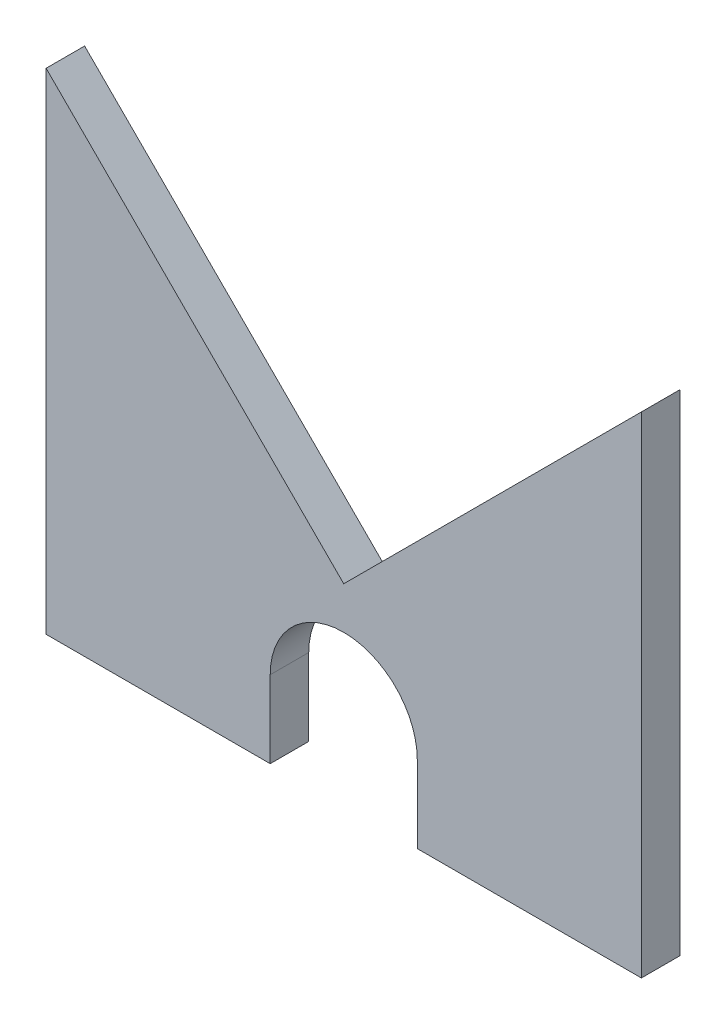
ISO-10303-21;
HEADER;
FILE_DESCRIPTION(('STEP AP214'),'2;1');
FILE_NAME('part.step','',(''),(''),'','','');
FILE_SCHEMA(('AUTOMOTIVE_DESIGN { 1 0 10303 214 1 1 1 1 }'));
ENDSEC;
DATA;
#1=APPLICATION_CONTEXT('core data for automotive mechanical design processes');
#2=APPLICATION_PROTOCOL_DEFINITION('international standard','automotive_design',2000,#1);
#3=PRODUCT_CONTEXT('',#1,'mechanical');
#4=PRODUCT('Part','Part','',(#3));
#5=PRODUCT_RELATED_PRODUCT_CATEGORY('part','',(#4));
#6=PRODUCT_DEFINITION_FORMATION('','',#4);
#7=PRODUCT_DEFINITION_CONTEXT('part definition',#1,'design');
#8=PRODUCT_DEFINITION('design','',#6,#7);
#9=PRODUCT_DEFINITION_SHAPE('','',#8);
#10=(LENGTH_UNIT() NAMED_UNIT(*) SI_UNIT(.MILLI.,.METRE.));
#11=(NAMED_UNIT(*) PLANE_ANGLE_UNIT() SI_UNIT($,.RADIAN.));
#12=(NAMED_UNIT(*) SI_UNIT($,.STERADIAN.) SOLID_ANGLE_UNIT());
#13=UNCERTAINTY_MEASURE_WITH_UNIT(LENGTH_MEASURE(1.E-05),#10,'distance_accuracy_value','');
#14=(GEOMETRIC_REPRESENTATION_CONTEXT(3) GLOBAL_UNCERTAINTY_ASSIGNED_CONTEXT((#13)) GLOBAL_UNIT_ASSIGNED_CONTEXT((#10,
#11,#12)) REPRESENTATION_CONTEXT('',''));
#15=CARTESIAN_POINT('',(0.,0.,0.));
#16=DIRECTION('',(0.,0.,1.));
#17=DIRECTION('',(1.,0.,0.));
#18=AXIS2_PLACEMENT_3D('',#15,#16,#17);
#19=CARTESIAN_POINT('',(17.,4.4,2.2));
#20=DIRECTION('',(0.,0.,-1.));
#21=DIRECTION('',(-1.,0.,0.));
#22=AXIS2_PLACEMENT_3D('',#19,#20,#21);
#23=CYLINDRICAL_SURFACE('',#22,4.2);
#24=CARTESIAN_POINT('',(17.,4.4,0.));
#25=DIRECTION('',(0.,0.,1.));
#26=DIRECTION('',(1.,0.,0.));
#27=AXIS2_PLACEMENT_3D('',#24,#25,#26);
#28=CIRCLE('',#27,4.2);
#29=CARTESIAN_POINT('',(21.2,4.4,0.));
#30=VERTEX_POINT('',#29);
#31=CARTESIAN_POINT('',(12.8,4.4,0.));
#32=VERTEX_POINT('',#31);
#33=EDGE_CURVE('E150',#30,#32,#28,.T.);
#34=ORIENTED_EDGE('',*,*,#33,.F.);
#35=DIRECTION('',(0.,0.,-1.));
#36=VECTOR('',#35,1.);
#37=CARTESIAN_POINT('',(21.2,4.4,2.2));
#38=LINE('',#37,#36);
#39=CARTESIAN_POINT('',(21.2,4.4,2.2));
#40=VERTEX_POINT('',#39);
#41=EDGE_CURVE('E11',#40,#30,#38,.T.);
#42=ORIENTED_EDGE('',*,*,#41,.F.);
#43=CARTESIAN_POINT('',(17.,4.4,2.2));
#44=DIRECTION('',(0.,0.,1.));
#45=DIRECTION('',(1.,0.,0.));
#46=AXIS2_PLACEMENT_3D('',#43,#44,#45);
#47=CIRCLE('',#46,4.2);
#48=CARTESIAN_POINT('',(12.8,4.4,2.2));
#49=VERTEX_POINT('',#48);
#50=EDGE_CURVE('E178',#40,#49,#47,.T.);
#51=ORIENTED_EDGE('',*,*,#50,.T.);
#52=DIRECTION('',(0.,0.,-1.));
#53=VECTOR('',#52,1.);
#54=CARTESIAN_POINT('',(12.8,4.4,2.2));
#55=LINE('',#54,#53);
#56=EDGE_CURVE('E58',#49,#32,#55,.T.);
#57=ORIENTED_EDGE('',*,*,#56,.T.);
#58=EDGE_LOOP('',(#34,#42,#51,#57));
#59=FACE_BOUND('',#58,.T.);
#60=ADVANCED_FACE('F41',(#59),#23,.F.);
#61=CARTESIAN_POINT('',(21.2,0.,2.2));
#62=DIRECTION('',(1.,0.,0.));
#63=DIRECTION('',(0.,0.,-1.));
#64=AXIS2_PLACEMENT_3D('',#61,#62,#63);
#65=PLANE('',#64);
#66=DIRECTION('',(0.,-1.,0.));
#67=VECTOR('',#66,1.);
#68=CARTESIAN_POINT('',(21.2,0.,0.));
#69=LINE('',#68,#67);
#70=CARTESIAN_POINT('',(21.2,0.,0.));
#71=VERTEX_POINT('',#70);
#72=EDGE_CURVE('E153',#30,#71,#69,.T.);
#73=ORIENTED_EDGE('',*,*,#72,.T.);
#74=DIRECTION('',(0.,0.,-1.));
#75=VECTOR('',#74,1.);
#76=CARTESIAN_POINT('',(21.2,0.,2.2));
#77=LINE('',#76,#75);
#78=CARTESIAN_POINT('',(21.2,0.,2.2));
#79=VERTEX_POINT('',#78);
#80=EDGE_CURVE('E50',#79,#71,#77,.T.);
#81=ORIENTED_EDGE('',*,*,#80,.F.);
#82=DIRECTION('',(0.,-1.,0.));
#83=VECTOR('',#82,1.);
#84=CARTESIAN_POINT('',(21.2,0.,2.2));
#85=LINE('',#84,#83);
#86=EDGE_CURVE('E218',#40,#79,#85,.T.);
#87=ORIENTED_EDGE('',*,*,#86,.F.);
#88=ORIENTED_EDGE('',*,*,#41,.T.);
#89=EDGE_LOOP('',(#73,#81,#87,#88));
#90=FACE_BOUND('',#89,.T.);
#91=ADVANCED_FACE('F234',(#90),#65,.F.);
#92=CARTESIAN_POINT('',(0.,0.,2.2));
#93=DIRECTION('',(0.,1.,0.));
#94=DIRECTION('',(0.,0.,1.));
#95=AXIS2_PLACEMENT_3D('',#92,#93,#94);
#96=PLANE('',#95);
#97=DIRECTION('',(1.,0.,0.));
#98=VECTOR('',#97,1.);
#99=CARTESIAN_POINT('',(0.,0.,0.));
#100=LINE('',#99,#98);
#101=CARTESIAN_POINT('',(34.,0.,0.));
#102=VERTEX_POINT('',#101);
#103=EDGE_CURVE('E156',#71,#102,#100,.T.);
#104=ORIENTED_EDGE('',*,*,#103,.T.);
#105=DIRECTION('',(0.,0.,-1.));
#106=VECTOR('',#105,1.);
#107=CARTESIAN_POINT('',(34.,0.,2.2));
#108=LINE('',#107,#106);
#109=CARTESIAN_POINT('',(34.,0.,2.2));
#110=VERTEX_POINT('',#109);
#111=EDGE_CURVE('E191',#110,#102,#108,.T.);
#112=ORIENTED_EDGE('',*,*,#111,.F.);
#113=DIRECTION('',(1.,0.,0.));
#114=VECTOR('',#113,1.);
#115=CARTESIAN_POINT('',(0.,0.,2.2));
#116=LINE('',#115,#114);
#117=EDGE_CURVE('E134',#79,#110,#116,.T.);
#118=ORIENTED_EDGE('',*,*,#117,.F.);
#119=ORIENTED_EDGE('',*,*,#80,.T.);
#120=EDGE_LOOP('',(#104,#112,#118,#119));
#121=FACE_BOUND('',#120,.T.);
#122=ADVANCED_FACE('F200',(#121),#96,.F.);
#123=CARTESIAN_POINT('',(34.,0.,2.2));
#124=DIRECTION('',(-1.,0.,0.));
#125=DIRECTION('',(0.,0.,1.));
#126=AXIS2_PLACEMENT_3D('',#123,#124,#125);
#127=PLANE('',#126);
#128=DIRECTION('',(0.,1.,0.));
#129=VECTOR('',#128,1.);
#130=CARTESIAN_POINT('',(34.,0.,0.));
#131=LINE('',#130,#129);
#132=CARTESIAN_POINT('',(34.,28.,0.));
#133=VERTEX_POINT('',#132);
#134=EDGE_CURVE('E159',#102,#133,#131,.T.);
#135=ORIENTED_EDGE('',*,*,#134,.T.);
#136=DIRECTION('',(0.,0.,-1.));
#137=VECTOR('',#136,1.);
#138=CARTESIAN_POINT('',(34.,28.,2.2));
#139=LINE('',#138,#137);
#140=CARTESIAN_POINT('',(34.,28.,2.2));
#141=VERTEX_POINT('',#140);
#142=EDGE_CURVE('E188',#141,#133,#139,.T.);
#143=ORIENTED_EDGE('',*,*,#142,.F.);
#144=DIRECTION('',(0.,1.,0.));
#145=VECTOR('',#144,1.);
#146=CARTESIAN_POINT('',(34.,0.,2.2));
#147=LINE('',#146,#145);
#148=EDGE_CURVE('E213',#110,#141,#147,.T.);
#149=ORIENTED_EDGE('',*,*,#148,.F.);
#150=ORIENTED_EDGE('',*,*,#111,.T.);
#151=EDGE_LOOP('',(#135,#143,#149,#150));
#152=FACE_BOUND('',#151,.T.);
#153=ADVANCED_FACE('F210',(#152),#127,.F.);
#154=CARTESIAN_POINT('',(3.00000000000007,-3.00000000000006,2.2));
#155=DIRECTION('',(-0.707106781186549,0.707106781186546,0.));
#156=DIRECTION('',(-0.707106781186546,-0.707106781186549,0.));
#157=AXIS2_PLACEMENT_3D('',#154,#155,#156);
#158=PLANE('',#157);
#159=DIRECTION('',(0.707106781186546,0.707106781186549,0.));
#160=VECTOR('',#159,1.);
#161=CARTESIAN_POINT('',(3.00000000000007,-3.00000000000006,0.));
#162=LINE('',#161,#160);
#163=CARTESIAN_POINT('',(17.,10.9999999999999,0.));
#164=VERTEX_POINT('',#163);
#165=EDGE_CURVE('E164',#164,#133,#162,.T.);
#166=ORIENTED_EDGE('',*,*,#165,.F.);
#167=DIRECTION('',(0.,0.,-1.));
#168=VECTOR('',#167,1.);
#169=CARTESIAN_POINT('',(17.,10.9999999999999,2.2));
#170=LINE('',#169,#168);
#171=CARTESIAN_POINT('',(17.,10.9999999999999,2.2));
#172=VERTEX_POINT('',#171);
#173=EDGE_CURVE('E185',#172,#164,#170,.T.);
#174=ORIENTED_EDGE('',*,*,#173,.F.);
#175=DIRECTION('',(0.707106781186546,0.707106781186549,0.));
#176=VECTOR('',#175,1.);
#177=CARTESIAN_POINT('',(3.00000000000007,-3.00000000000006,2.2));
#178=LINE('',#177,#176);
#179=EDGE_CURVE('E144',#172,#141,#178,.T.);
#180=ORIENTED_EDGE('',*,*,#179,.T.);
#181=ORIENTED_EDGE('',*,*,#142,.T.);
#182=EDGE_LOOP('',(#166,#174,#180,#181));
#183=FACE_BOUND('',#182,.T.);
#184=ADVANCED_FACE('F244',(#183),#158,.T.);
#185=CARTESIAN_POINT('',(14.,14.,2.2));
#186=DIRECTION('',(0.707106781186549,0.707106781186546,0.));
#187=DIRECTION('',(-0.707106781186546,0.707106781186549,0.));
#188=AXIS2_PLACEMENT_3D('',#185,#186,#187);
#189=PLANE('',#188);
#190=DIRECTION('',(0.707106781186546,-0.707106781186549,0.));
#191=VECTOR('',#190,1.);
#192=CARTESIAN_POINT('',(14.,14.,0.));
#193=LINE('',#192,#191);
#194=CARTESIAN_POINT('',(0.,28.,0.));
#195=VERTEX_POINT('',#194);
#196=EDGE_CURVE('E168',#195,#164,#193,.T.);
#197=ORIENTED_EDGE('',*,*,#196,.F.);
#198=DIRECTION('',(0.,0.,-1.));
#199=VECTOR('',#198,1.);
#200=CARTESIAN_POINT('',(0.,28.,2.2));
#201=LINE('',#200,#199);
#202=CARTESIAN_POINT('',(0.,28.,2.2));
#203=VERTEX_POINT('',#202);
#204=EDGE_CURVE('E125',#203,#195,#201,.T.);
#205=ORIENTED_EDGE('',*,*,#204,.F.);
#206=DIRECTION('',(0.707106781186546,-0.707106781186549,0.));
#207=VECTOR('',#206,1.);
#208=CARTESIAN_POINT('',(14.,14.,2.2));
#209=LINE('',#208,#207);
#210=EDGE_CURVE('E140',#203,#172,#209,.T.);
#211=ORIENTED_EDGE('',*,*,#210,.T.);
#212=ORIENTED_EDGE('',*,*,#173,.T.);
#213=EDGE_LOOP('',(#197,#205,#211,#212));
#214=FACE_BOUND('',#213,.T.);
#215=ADVANCED_FACE('F247',(#214),#189,.T.);
#216=CARTESIAN_POINT('',(0.,0.,2.2));
#217=DIRECTION('',(-1.,0.,0.));
#218=DIRECTION('',(0.,0.,1.));
#219=AXIS2_PLACEMENT_3D('',#216,#217,#218);
#220=PLANE('',#219);
#221=DIRECTION('',(0.,1.,0.));
#222=VECTOR('',#221,1.);
#223=CARTESIAN_POINT('',(0.,0.,0.));
#224=LINE('',#223,#222);
#225=CARTESIAN_POINT('',(0.,0.,0.));
#226=VERTEX_POINT('',#225);
#227=EDGE_CURVE('E121',#226,#195,#224,.T.);
#228=ORIENTED_EDGE('',*,*,#227,.F.);
#229=DIRECTION('',(0.,0.,-1.));
#230=VECTOR('',#229,1.);
#231=CARTESIAN_POINT('',(0.,0.,2.2));
#232=LINE('',#231,#230);
#233=CARTESIAN_POINT('',(0.,0.,2.2));
#234=VERTEX_POINT('',#233);
#235=EDGE_CURVE('E115',#234,#226,#232,.T.);
#236=ORIENTED_EDGE('',*,*,#235,.F.);
#237=DIRECTION('',(0.,1.,0.));
#238=VECTOR('',#237,1.);
#239=CARTESIAN_POINT('',(0.,0.,2.2));
#240=LINE('',#239,#238);
#241=EDGE_CURVE('E119',#234,#203,#240,.T.);
#242=ORIENTED_EDGE('',*,*,#241,.T.);
#243=ORIENTED_EDGE('',*,*,#204,.T.);
#244=EDGE_LOOP('',(#228,#236,#242,#243));
#245=FACE_BOUND('',#244,.T.);
#246=ADVANCED_FACE('F117',(#245),#220,.T.);
#247=CARTESIAN_POINT('',(12.8,0.,0.));
#248=VERTEX_POINT('',#247);
#249=EDGE_CURVE('E160',#226,#248,#100,.T.);
#250=ORIENTED_EDGE('',*,*,#249,.T.);
#251=DIRECTION('',(0.,0.,-1.));
#252=VECTOR('',#251,1.);
#253=CARTESIAN_POINT('',(12.8,0.,2.2));
#254=LINE('',#253,#252);
#255=CARTESIAN_POINT('',(12.8,0.,2.2));
#256=VERTEX_POINT('',#255);
#257=EDGE_CURVE('E87',#256,#248,#254,.T.);
#258=ORIENTED_EDGE('',*,*,#257,.F.);
#259=EDGE_CURVE('E127',#234,#256,#116,.T.);
#260=ORIENTED_EDGE('',*,*,#259,.F.);
#261=ORIENTED_EDGE('',*,*,#235,.T.);
#262=EDGE_LOOP('',(#250,#258,#260,#261));
#263=FACE_BOUND('',#262,.T.);
#264=ADVANCED_FACE('F128',(#263),#96,.F.);
#265=CARTESIAN_POINT('',(12.8,0.,2.2));
#266=DIRECTION('',(1.,0.,0.));
#267=DIRECTION('',(0.,0.,-1.));
#268=AXIS2_PLACEMENT_3D('',#265,#266,#267);
#269=PLANE('',#268);
#270=DIRECTION('',(0.,-1.,0.));
#271=VECTOR('',#270,1.);
#272=CARTESIAN_POINT('',(12.8,0.,0.));
#273=LINE('',#272,#271);
#274=EDGE_CURVE('E174',#32,#248,#273,.T.);
#275=ORIENTED_EDGE('',*,*,#274,.F.);
#276=ORIENTED_EDGE('',*,*,#56,.F.);
#277=DIRECTION('',(0.,-1.,0.));
#278=VECTOR('',#277,1.);
#279=CARTESIAN_POINT('',(12.8,0.,2.2));
#280=LINE('',#279,#278);
#281=EDGE_CURVE('E132',#49,#256,#280,.T.);
#282=ORIENTED_EDGE('',*,*,#281,.T.);
#283=ORIENTED_EDGE('',*,*,#257,.T.);
#284=EDGE_LOOP('',(#275,#276,#282,#283));
#285=FACE_BOUND('',#284,.T.);
#286=ADVANCED_FACE('F223',(#285),#269,.T.);
#287=CARTESIAN_POINT('',(0.,0.,2.2));
#288=DIRECTION('',(0.,0.,1.));
#289=DIRECTION('',(1.,0.,0.));
#290=AXIS2_PLACEMENT_3D('',#287,#288,#289);
#291=PLANE('',#290);
#292=ORIENTED_EDGE('',*,*,#50,.F.);
#293=ORIENTED_EDGE('',*,*,#86,.T.);
#294=ORIENTED_EDGE('',*,*,#117,.T.);
#295=ORIENTED_EDGE('',*,*,#148,.T.);
#296=ORIENTED_EDGE('',*,*,#179,.F.);
#297=ORIENTED_EDGE('',*,*,#210,.F.);
#298=ORIENTED_EDGE('',*,*,#241,.F.);
#299=ORIENTED_EDGE('',*,*,#259,.T.);
#300=ORIENTED_EDGE('',*,*,#281,.F.);
#301=EDGE_LOOP('',(#292,#293,#294,#295,#296,#297,#298,#299,#300));
#302=FACE_BOUND('',#301,.T.);
#303=ADVANCED_FACE('F137',(#302),#291,.T.);
#304=CARTESIAN_POINT('',(0.,0.,0.));
#305=DIRECTION('',(0.,0.,1.));
#306=DIRECTION('',(1.,0.,0.));
#307=AXIS2_PLACEMENT_3D('',#304,#305,#306);
#308=PLANE('',#307);
#309=ORIENTED_EDGE('',*,*,#33,.T.);
#310=ORIENTED_EDGE('',*,*,#274,.T.);
#311=ORIENTED_EDGE('',*,*,#249,.F.);
#312=ORIENTED_EDGE('',*,*,#227,.T.);
#313=ORIENTED_EDGE('',*,*,#196,.T.);
#314=ORIENTED_EDGE('',*,*,#165,.T.);
#315=ORIENTED_EDGE('',*,*,#134,.F.);
#316=ORIENTED_EDGE('',*,*,#103,.F.);
#317=ORIENTED_EDGE('',*,*,#72,.F.);
#318=EDGE_LOOP('',(#309,#310,#311,#312,#313,#314,#315,#316,#317));
#319=FACE_BOUND('',#318,.T.);
#320=ADVANCED_FACE('F206',(#319),#308,.F.);
#321=CLOSED_SHELL('',(#60,#91,#122,#153,#184,#215,#246,#264,#286,#303,#320));
#322=MANIFOLD_SOLID_BREP('B2',#321);
#323=ADVANCED_BREP_SHAPE_REPRESENTATION('',(#18,#322),#14);
#324=SHAPE_DEFINITION_REPRESENTATION(#9,#323);
ENDSEC;
END-ISO-10303-21;
